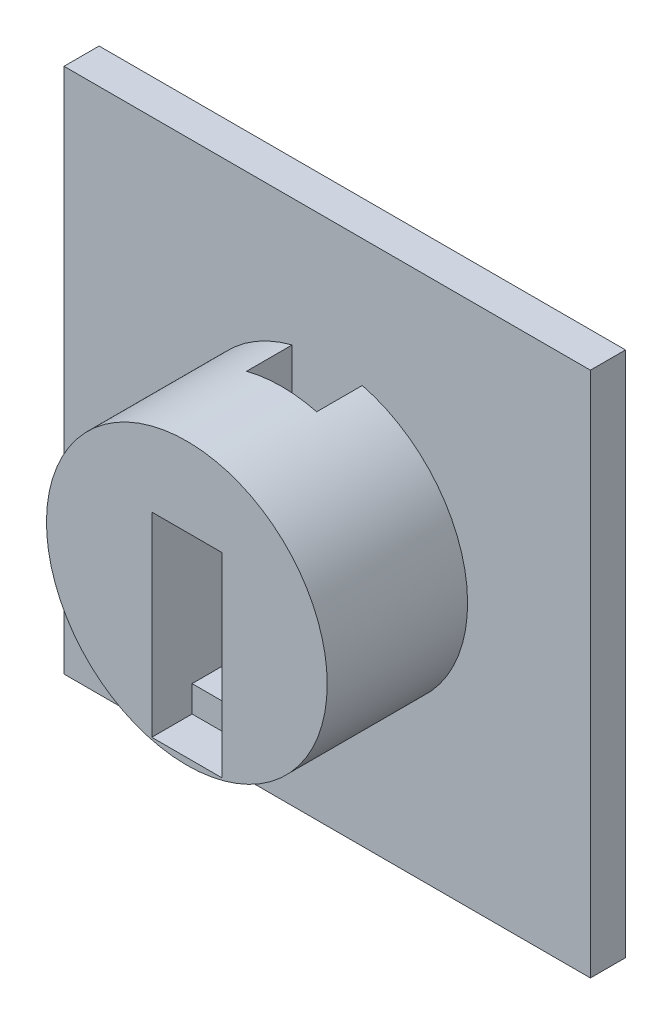
ISO-10303-21;
HEADER;
FILE_DESCRIPTION(('STEP AP214'),'2;1');
FILE_NAME('part.step','',(''),(''),'','','');
FILE_SCHEMA(('AUTOMOTIVE_DESIGN { 1 0 10303 214 1 1 1 1 }'));
ENDSEC;
DATA;
#1=APPLICATION_CONTEXT('core data for automotive mechanical design processes');
#2=APPLICATION_PROTOCOL_DEFINITION('international standard','automotive_design',2000,#1);
#3=PRODUCT_CONTEXT('',#1,'mechanical');
#4=PRODUCT('Part','Part','',(#3));
#5=PRODUCT_RELATED_PRODUCT_CATEGORY('part','',(#4));
#6=PRODUCT_DEFINITION_FORMATION('','',#4);
#7=PRODUCT_DEFINITION_CONTEXT('part definition',#1,'design');
#8=PRODUCT_DEFINITION('design','',#6,#7);
#9=PRODUCT_DEFINITION_SHAPE('','',#8);
#10=(LENGTH_UNIT() NAMED_UNIT(*) SI_UNIT(.MILLI.,.METRE.));
#11=(NAMED_UNIT(*) PLANE_ANGLE_UNIT() SI_UNIT($,.RADIAN.));
#12=(NAMED_UNIT(*) SI_UNIT($,.STERADIAN.) SOLID_ANGLE_UNIT());
#13=UNCERTAINTY_MEASURE_WITH_UNIT(LENGTH_MEASURE(1.E-05),#10,'distance_accuracy_value','');
#14=(GEOMETRIC_REPRESENTATION_CONTEXT(3) GLOBAL_UNCERTAINTY_ASSIGNED_CONTEXT((#13)) GLOBAL_UNIT_ASSIGNED_CONTEXT((#10,
#11,#12)) REPRESENTATION_CONTEXT('',''));
#15=CARTESIAN_POINT('',(0.,0.,0.));
#16=DIRECTION('',(0.,0.,1.));
#17=DIRECTION('',(1.,0.,0.));
#18=AXIS2_PLACEMENT_3D('',#15,#16,#17);
#19=CARTESIAN_POINT('',(0.,10.,9.00000000000001));
#20=DIRECTION('',(0.,1.,0.));
#21=DIRECTION('',(0.,0.,1.));
#22=AXIS2_PLACEMENT_3D('',#19,#20,#21);
#23=PLANE('',#22);
#24=DIRECTION('',(1.,0.,0.));
#25=VECTOR('',#24,1.);
#26=CARTESIAN_POINT('',(-9.99999999999999,10.,23.));
#27=LINE('',#26,#25);
#28=CARTESIAN_POINT('',(-9.99999999999999,10.,23.));
#29=VERTEX_POINT('',#28);
#30=CARTESIAN_POINT('',(10.,10.,23.));
#31=VERTEX_POINT('',#30);
#32=EDGE_CURVE('E332',#29,#31,#27,.T.);
#33=ORIENTED_EDGE('',*,*,#32,.T.);
#34=DIRECTION('',(0.,0.,1.));
#35=VECTOR('',#34,1.);
#36=CARTESIAN_POINT('',(10.,10.,9.00000000000001));
#37=LINE('',#36,#35);
#38=CARTESIAN_POINT('',(10.,10.,38.5));
#39=VERTEX_POINT('',#38);
#40=EDGE_CURVE('E195',#31,#39,#37,.T.);
#41=ORIENTED_EDGE('',*,*,#40,.T.);
#42=DIRECTION('',(1.,0.,0.));
#43=VECTOR('',#42,1.);
#44=CARTESIAN_POINT('',(10.,10.,38.5));
#45=LINE('',#44,#43);
#46=CARTESIAN_POINT('',(-9.99999999999999,10.,38.5));
#47=VERTEX_POINT('',#46);
#48=EDGE_CURVE('E381',#47,#39,#45,.T.);
#49=ORIENTED_EDGE('',*,*,#48,.F.);
#50=DIRECTION('',(0.,0.,1.));
#51=VECTOR('',#50,1.);
#52=CARTESIAN_POINT('',(-10.,10.,9.00000000000001));
#53=LINE('',#52,#51);
#54=EDGE_CURVE('E184',#29,#47,#53,.T.);
#55=ORIENTED_EDGE('',*,*,#54,.F.);
#56=EDGE_LOOP('',(#33,#41,#49,#55));
#57=FACE_BOUND('',#56,.T.);
#58=ADVANCED_FACE('F45',(#57),#23,.F.);
#59=CARTESIAN_POINT('',(-9.99999999999999,-30.6,9.00000000000001));
#60=DIRECTION('',(0.,-1.,0.));
#61=DIRECTION('',(0.,0.,-1.));
#62=AXIS2_PLACEMENT_3D('',#59,#60,#61);
#63=PLANE('',#62);
#64=DIRECTION('',(-1.,0.,0.));
#65=VECTOR('',#64,1.);
#66=CARTESIAN_POINT('',(-9.99999999999999,-30.6,38.5));
#67=LINE('',#66,#65);
#68=CARTESIAN_POINT('',(10.,-30.6,38.5));
#69=VERTEX_POINT('',#68);
#70=CARTESIAN_POINT('',(-9.99999999999999,-30.6,38.5));
#71=VERTEX_POINT('',#70);
#72=EDGE_CURVE('E341',#69,#71,#67,.T.);
#73=ORIENTED_EDGE('',*,*,#72,.F.);
#74=DIRECTION('',(0.,0.,1.));
#75=VECTOR('',#74,1.);
#76=CARTESIAN_POINT('',(10.,-30.6,9.00000000000001));
#77=LINE('',#76,#75);
#78=CARTESIAN_POINT('',(10.,-30.6,9.00000000000001));
#79=VERTEX_POINT('',#78);
#80=EDGE_CURVE('E196',#79,#69,#77,.T.);
#81=ORIENTED_EDGE('',*,*,#80,.F.);
#82=DIRECTION('',(1.,0.,0.));
#83=VECTOR('',#82,1.);
#84=CARTESIAN_POINT('',(-9.99999999999999,-30.6,9.00000000000001));
#85=LINE('',#84,#83);
#86=CARTESIAN_POINT('',(-9.99999999999999,-30.6,9.00000000000001));
#87=VERTEX_POINT('',#86);
#88=EDGE_CURVE('E396',#87,#79,#85,.T.);
#89=ORIENTED_EDGE('',*,*,#88,.F.);
#90=DIRECTION('',(0.,0.,1.));
#91=VECTOR('',#90,1.);
#92=CARTESIAN_POINT('',(-9.99999999999999,-30.6,9.00000000000001));
#93=LINE('',#92,#91);
#94=EDGE_CURVE('E183',#87,#71,#93,.T.);
#95=ORIENTED_EDGE('',*,*,#94,.T.);
#96=EDGE_LOOP('',(#73,#81,#89,#95));
#97=FACE_BOUND('',#96,.T.);
#98=ADVANCED_FACE('F272',(#97),#63,.F.);
#99=CARTESIAN_POINT('',(-75.,-75.,10.));
#100=DIRECTION('',(0.,1.,0.));
#101=DIRECTION('',(-1.,0.,0.));
#102=AXIS2_PLACEMENT_3D('',#99,#100,#101);
#103=PLANE('',#102);
#104=DIRECTION('',(1.,0.,0.));
#105=VECTOR('',#104,1.);
#106=CARTESIAN_POINT('',(-75.,-75.,0.));
#107=LINE('',#106,#105);
#108=CARTESIAN_POINT('',(-75.,-75.,0.));
#109=VERTEX_POINT('',#108);
#110=CARTESIAN_POINT('',(75.,-75.,0.));
#111=VERTEX_POINT('',#110);
#112=EDGE_CURVE('E202',#109,#111,#107,.T.);
#113=ORIENTED_EDGE('',*,*,#112,.T.);
#114=DIRECTION('',(0.,0.,-1.));
#115=VECTOR('',#114,1.);
#116=CARTESIAN_POINT('',(75.,-75.,10.));
#117=LINE('',#116,#115);
#118=CARTESIAN_POINT('',(75.,-75.,10.));
#119=VERTEX_POINT('',#118);
#120=EDGE_CURVE('E49',#119,#111,#117,.T.);
#121=ORIENTED_EDGE('',*,*,#120,.F.);
#122=DIRECTION('',(1.,0.,0.));
#123=VECTOR('',#122,1.);
#124=CARTESIAN_POINT('',(-75.,-75.,10.));
#125=LINE('',#124,#123);
#126=CARTESIAN_POINT('',(-75.,-75.,10.));
#127=VERTEX_POINT('',#126);
#128=EDGE_CURVE('E204',#127,#119,#125,.T.);
#129=ORIENTED_EDGE('',*,*,#128,.F.);
#130=DIRECTION('',(0.,0.,-1.));
#131=VECTOR('',#130,1.);
#132=CARTESIAN_POINT('',(-75.,-75.,10.));
#133=LINE('',#132,#131);
#134=EDGE_CURVE('E218',#127,#109,#133,.T.);
#135=ORIENTED_EDGE('',*,*,#134,.T.);
#136=EDGE_LOOP('',(#113,#121,#129,#135));
#137=FACE_BOUND('',#136,.T.);
#138=ADVANCED_FACE('F47',(#137),#103,.F.);
#139=CARTESIAN_POINT('',(75.,75.,10.));
#140=DIRECTION('',(-1.,0.,0.));
#141=DIRECTION('',(0.,-1.,0.));
#142=AXIS2_PLACEMENT_3D('',#139,#140,#141);
#143=PLANE('',#142);
#144=DIRECTION('',(0.,1.,0.));
#145=VECTOR('',#144,1.);
#146=CARTESIAN_POINT('',(75.,75.,0.));
#147=LINE('',#146,#145);
#148=CARTESIAN_POINT('',(75.,75.,0.));
#149=VERTEX_POINT('',#148);
#150=EDGE_CURVE('E222',#111,#149,#147,.T.);
#151=ORIENTED_EDGE('',*,*,#150,.T.);
#152=DIRECTION('',(0.,0.,-1.));
#153=VECTOR('',#152,1.);
#154=CARTESIAN_POINT('',(75.,75.,10.));
#155=LINE('',#154,#153);
#156=CARTESIAN_POINT('',(75.,75.,10.));
#157=VERTEX_POINT('',#156);
#158=EDGE_CURVE('E236',#157,#149,#155,.T.);
#159=ORIENTED_EDGE('',*,*,#158,.F.);
#160=DIRECTION('',(0.,1.,0.));
#161=VECTOR('',#160,1.);
#162=CARTESIAN_POINT('',(75.,75.,10.));
#163=LINE('',#162,#161);
#164=EDGE_CURVE('E208',#119,#157,#163,.T.);
#165=ORIENTED_EDGE('',*,*,#164,.F.);
#166=ORIENTED_EDGE('',*,*,#120,.T.);
#167=EDGE_LOOP('',(#151,#159,#165,#166));
#168=FACE_BOUND('',#167,.T.);
#169=ADVANCED_FACE('F247',(#168),#143,.F.);
#170=CARTESIAN_POINT('',(-75.,75.,10.));
#171=DIRECTION('',(0.,-1.,0.));
#172=DIRECTION('',(1.,0.,0.));
#173=AXIS2_PLACEMENT_3D('',#170,#171,#172);
#174=PLANE('',#173);
#175=DIRECTION('',(-1.,0.,0.));
#176=VECTOR('',#175,1.);
#177=CARTESIAN_POINT('',(-75.,75.,0.));
#178=LINE('',#177,#176);
#179=CARTESIAN_POINT('',(-75.,75.,0.));
#180=VERTEX_POINT('',#179);
#181=EDGE_CURVE('E225',#149,#180,#178,.T.);
#182=ORIENTED_EDGE('',*,*,#181,.T.);
#183=DIRECTION('',(0.,0.,-1.));
#184=VECTOR('',#183,1.);
#185=CARTESIAN_POINT('',(-75.,75.,10.));
#186=LINE('',#185,#184);
#187=CARTESIAN_POINT('',(-75.,75.,10.));
#188=VERTEX_POINT('',#187);
#189=EDGE_CURVE('E233',#188,#180,#186,.T.);
#190=ORIENTED_EDGE('',*,*,#189,.F.);
#191=DIRECTION('',(-1.,0.,0.));
#192=VECTOR('',#191,1.);
#193=CARTESIAN_POINT('',(-75.,75.,10.));
#194=LINE('',#193,#192);
#195=EDGE_CURVE('E212',#157,#188,#194,.T.);
#196=ORIENTED_EDGE('',*,*,#195,.F.);
#197=ORIENTED_EDGE('',*,*,#158,.T.);
#198=EDGE_LOOP('',(#182,#190,#196,#197));
#199=FACE_BOUND('',#198,.T.);
#200=ADVANCED_FACE('F256',(#199),#174,.F.);
#201=CARTESIAN_POINT('',(-75.,75.,10.));
#202=DIRECTION('',(1.,0.,0.));
#203=DIRECTION('',(0.,1.,0.));
#204=AXIS2_PLACEMENT_3D('',#201,#202,#203);
#205=PLANE('',#204);
#206=DIRECTION('',(0.,-1.,0.));
#207=VECTOR('',#206,1.);
#208=CARTESIAN_POINT('',(-75.,75.,0.));
#209=LINE('',#208,#207);
#210=EDGE_CURVE('E209',#180,#109,#209,.T.);
#211=ORIENTED_EDGE('',*,*,#210,.T.);
#212=ORIENTED_EDGE('',*,*,#134,.F.);
#213=DIRECTION('',(0.,-1.,0.));
#214=VECTOR('',#213,1.);
#215=CARTESIAN_POINT('',(-75.,75.,10.));
#216=LINE('',#215,#214);
#217=EDGE_CURVE('E215',#188,#127,#216,.T.);
#218=ORIENTED_EDGE('',*,*,#217,.F.);
#219=ORIENTED_EDGE('',*,*,#189,.T.);
#220=EDGE_LOOP('',(#211,#212,#218,#219));
#221=FACE_BOUND('',#220,.T.);
#222=ADVANCED_FACE('F259',(#221),#205,.F.);
#223=CARTESIAN_POINT('',(0.,0.,10.));
#224=DIRECTION('',(0.,0.,-1.));
#225=DIRECTION('',(-1.,0.,0.));
#226=AXIS2_PLACEMENT_3D('',#223,#224,#225);
#227=PLANE('',#226);
#228=CARTESIAN_POINT('',(0.,0.,10.));
#229=DIRECTION('',(0.,0.,1.));
#230=DIRECTION('',(1.,0.,0.));
#231=AXIS2_PLACEMENT_3D('',#228,#229,#230);
#232=CIRCLE('',#231,40.);
#233=CARTESIAN_POINT('',(-9.99999999999999,38.7298334620742,9.99999999999999));
#234=VERTEX_POINT('',#233);
#235=CARTESIAN_POINT('',(10.,38.7298334620742,9.99999999999999));
#236=VERTEX_POINT('',#235);
#237=EDGE_CURVE('E11',#234,#236,#232,.T.);
#238=ORIENTED_EDGE('',*,*,#237,.F.);
#239=DIRECTION('',(0.,-1.,0.));
#240=VECTOR('',#239,1.);
#241=CARTESIAN_POINT('',(-9.99999999999999,10.,10.));
#242=LINE('',#241,#240);
#243=CARTESIAN_POINT('',(-9.99999999999999,10.,10.));
#244=VERTEX_POINT('',#243);
#245=EDGE_CURVE('E159',#234,#244,#242,.T.);
#246=ORIENTED_EDGE('',*,*,#245,.T.);
#247=DIRECTION('',(1.,0.,0.));
#248=VECTOR('',#247,1.);
#249=CARTESIAN_POINT('',(-9.99999999999999,10.,10.));
#250=LINE('',#249,#248);
#251=CARTESIAN_POINT('',(10.,10.,10.));
#252=VERTEX_POINT('',#251);
#253=EDGE_CURVE('E70',#244,#252,#250,.T.);
#254=ORIENTED_EDGE('',*,*,#253,.T.);
#255=DIRECTION('',(0.,1.,0.));
#256=VECTOR('',#255,1.);
#257=CARTESIAN_POINT('',(10.,10.,10.));
#258=LINE('',#257,#256);
#259=EDGE_CURVE('E177',#252,#236,#258,.T.);
#260=ORIENTED_EDGE('',*,*,#259,.T.);
#261=EDGE_LOOP('',(#238,#246,#254,#260));
#262=FACE_BOUND('',#261,.T.);
#263=ORIENTED_EDGE('',*,*,#128,.T.);
#264=ORIENTED_EDGE('',*,*,#164,.T.);
#265=ORIENTED_EDGE('',*,*,#195,.T.);
#266=ORIENTED_EDGE('',*,*,#217,.T.);
#267=EDGE_LOOP('',(#263,#264,#265,#266));
#268=FACE_BOUND('',#267,.T.);
#269=ADVANCED_FACE('F160',(#262,#268),#227,.F.);
#270=CARTESIAN_POINT('',(0.,0.,0.));
#271=DIRECTION('',(0.,0.,-1.));
#272=DIRECTION('',(-1.,0.,0.));
#273=AXIS2_PLACEMENT_3D('',#270,#271,#272);
#274=PLANE('',#273);
#275=ORIENTED_EDGE('',*,*,#112,.F.);
#276=ORIENTED_EDGE('',*,*,#210,.F.);
#277=ORIENTED_EDGE('',*,*,#181,.F.);
#278=ORIENTED_EDGE('',*,*,#150,.F.);
#279=EDGE_LOOP('',(#275,#276,#277,#278));
#280=FACE_BOUND('',#279,.T.);
#281=ADVANCED_FACE('F254',(#280),#274,.T.);
#282=CARTESIAN_POINT('',(0.,0.,50.));
#283=DIRECTION('',(0.,0.,-1.));
#284=DIRECTION('',(-1.,0.,0.));
#285=AXIS2_PLACEMENT_3D('',#282,#283,#284);
#286=CYLINDRICAL_SURFACE('',#285,40.);
#287=CARTESIAN_POINT('',(0.,0.,50.));
#288=DIRECTION('',(0.,0.,1.));
#289=DIRECTION('',(1.,0.,0.));
#290=AXIS2_PLACEMENT_3D('',#287,#288,#289);
#291=CIRCLE('',#290,40.);
#292=CARTESIAN_POINT('',(40.,0.,50.));
#293=VERTEX_POINT('',#292);
#294=EDGE_CURVE('E189',#293,#293,#291,.T.);
#295=ORIENTED_EDGE('',*,*,#294,.F.);
#296=EDGE_LOOP('',(#295));
#297=FACE_BOUND('',#296,.T.);
#298=CARTESIAN_POINT('',(0.,0.,23.));
#299=DIRECTION('',(0.,0.,-1.));
#300=DIRECTION('',(-1.,0.,0.));
#301=AXIS2_PLACEMENT_3D('',#298,#299,#300);
#302=CIRCLE('',#301,40.);
#303=CARTESIAN_POINT('',(-9.99999999999999,38.7298334620742,23.));
#304=VERTEX_POINT('',#303);
#305=CARTESIAN_POINT('',(10.,38.7298334620742,23.));
#306=VERTEX_POINT('',#305);
#307=EDGE_CURVE('E322',#304,#306,#302,.T.);
#308=ORIENTED_EDGE('',*,*,#307,.F.);
#309=DIRECTION('',(0.,0.,-1.));
#310=VECTOR('',#309,1.);
#311=CARTESIAN_POINT('',(-9.99999999999999,38.7298334620742,50.));
#312=LINE('',#311,#310);
#313=EDGE_CURVE('E335',#304,#234,#312,.T.);
#314=ORIENTED_EDGE('',*,*,#313,.T.);
#315=ORIENTED_EDGE('',*,*,#237,.T.);
#316=DIRECTION('',(0.,0.,-1.));
#317=VECTOR('',#316,1.);
#318=CARTESIAN_POINT('',(10.,38.7298334620742,50.));
#319=LINE('',#318,#317);
#320=EDGE_CURVE('E327',#236,#306,#319,.F.);
#321=ORIENTED_EDGE('',*,*,#320,.T.);
#322=EDGE_LOOP('',(#308,#314,#315,#321));
#323=FACE_BOUND('',#322,.T.);
#324=ADVANCED_FACE('F267',(#297,#323),#286,.T.);
#325=CARTESIAN_POINT('',(0.,0.,50.));
#326=DIRECTION('',(0.,0.,1.));
#327=DIRECTION('',(1.,0.,0.));
#328=AXIS2_PLACEMENT_3D('',#325,#326,#327);
#329=PLANE('',#328);
#330=DIRECTION('',(0.,1.,0.));
#331=VECTOR('',#330,1.);
#332=CARTESIAN_POINT('',(10.,-30.6,50.));
#333=LINE('',#332,#331);
#334=CARTESIAN_POINT('',(10.,-38.1,50.));
#335=VERTEX_POINT('',#334);
#336=CARTESIAN_POINT('',(10.,17.5,50.));
#337=VERTEX_POINT('',#336);
#338=EDGE_CURVE('E366',#335,#337,#333,.T.);
#339=ORIENTED_EDGE('',*,*,#338,.F.);
#340=DIRECTION('',(1.,0.,0.));
#341=VECTOR('',#340,1.);
#342=CARTESIAN_POINT('',(-9.99999999999999,-38.1,50.));
#343=LINE('',#342,#341);
#344=CARTESIAN_POINT('',(-9.99999999999999,-38.1,50.));
#345=VERTEX_POINT('',#344);
#346=EDGE_CURVE('E346',#345,#335,#343,.T.);
#347=ORIENTED_EDGE('',*,*,#346,.F.);
#348=DIRECTION('',(0.,-1.,0.));
#349=VECTOR('',#348,1.);
#350=CARTESIAN_POINT('',(-10.,10.,50.));
#351=LINE('',#350,#349);
#352=CARTESIAN_POINT('',(-10.,17.5,50.));
#353=VERTEX_POINT('',#352);
#354=EDGE_CURVE('E401',#353,#345,#351,.T.);
#355=ORIENTED_EDGE('',*,*,#354,.F.);
#356=DIRECTION('',(-1.,0.,0.));
#357=VECTOR('',#356,1.);
#358=CARTESIAN_POINT('',(-10.,17.5,50.));
#359=LINE('',#358,#357);
#360=EDGE_CURVE('E361',#337,#353,#359,.T.);
#361=ORIENTED_EDGE('',*,*,#360,.F.);
#362=EDGE_LOOP('',(#339,#347,#355,#361));
#363=FACE_BOUND('',#362,.T.);
#364=ORIENTED_EDGE('',*,*,#294,.T.);
#365=EDGE_LOOP('',(#364));
#366=FACE_BOUND('',#365,.T.);
#367=ADVANCED_FACE('F292',(#363,#366),#329,.T.);
#368=CARTESIAN_POINT('',(-10.,10.,9.00000000000001));
#369=DIRECTION('',(-1.,0.,0.));
#370=DIRECTION('',(0.,-1.,0.));
#371=AXIS2_PLACEMENT_3D('',#368,#369,#370);
#372=PLANE('',#371);
#373=ORIENTED_EDGE('',*,*,#354,.T.);
#374=DIRECTION('',(0.,0.,1.));
#375=VECTOR('',#374,1.);
#376=CARTESIAN_POINT('',(-9.99999999999999,-38.1,38.5));
#377=LINE('',#376,#375);
#378=CARTESIAN_POINT('',(-9.99999999999999,-38.1,38.5));
#379=VERTEX_POINT('',#378);
#380=EDGE_CURVE('E357',#379,#345,#377,.T.);
#381=ORIENTED_EDGE('',*,*,#380,.F.);
#382=DIRECTION('',(0.,-1.,0.));
#383=VECTOR('',#382,1.);
#384=CARTESIAN_POINT('',(-9.99999999999999,-30.6,38.5));
#385=LINE('',#384,#383);
#386=EDGE_CURVE('E345',#71,#379,#385,.T.);
#387=ORIENTED_EDGE('',*,*,#386,.F.);
#388=ORIENTED_EDGE('',*,*,#94,.F.);
#389=DIRECTION('',(0.,-1.,0.));
#390=VECTOR('',#389,1.);
#391=CARTESIAN_POINT('',(-10.,10.,9.00000000000001));
#392=LINE('',#391,#390);
#393=CARTESIAN_POINT('',(-10.,10.,9.00000000000001));
#394=VERTEX_POINT('',#393);
#395=EDGE_CURVE('E181',#394,#87,#392,.T.);
#396=ORIENTED_EDGE('',*,*,#395,.F.);
#397=EDGE_CURVE('E173',#394,#244,#53,.T.);
#398=ORIENTED_EDGE('',*,*,#397,.T.);
#399=ORIENTED_EDGE('',*,*,#245,.F.);
#400=ORIENTED_EDGE('',*,*,#313,.F.);
#401=DIRECTION('',(0.,-1.,0.));
#402=VECTOR('',#401,1.);
#403=CARTESIAN_POINT('',(-9.99999999999999,10.,23.));
#404=LINE('',#403,#402);
#405=EDGE_CURVE('E62',#304,#29,#404,.T.);
#406=ORIENTED_EDGE('',*,*,#405,.T.);
#407=ORIENTED_EDGE('',*,*,#54,.T.);
#408=DIRECTION('',(0.,-1.,0.));
#409=VECTOR('',#408,1.);
#410=CARTESIAN_POINT('',(-9.99999999999999,10.,38.5));
#411=LINE('',#410,#409);
#412=CARTESIAN_POINT('',(-10.,17.5,38.5));
#413=VERTEX_POINT('',#412);
#414=EDGE_CURVE('E374',#413,#47,#411,.T.);
#415=ORIENTED_EDGE('',*,*,#414,.F.);
#416=DIRECTION('',(0.,0.,1.));
#417=VECTOR('',#416,1.);
#418=CARTESIAN_POINT('',(-10.,17.5,38.5));
#419=LINE('',#418,#417);
#420=EDGE_CURVE('E338',#413,#353,#419,.T.);
#421=ORIENTED_EDGE('',*,*,#420,.T.);
#422=EDGE_LOOP('',(#373,#381,#387,#388,#396,#398,#399,#400,#406,#407,#415,#421));
#423=FACE_BOUND('',#422,.T.);
#424=ADVANCED_FACE('F179',(#423),#372,.F.);
#425=CARTESIAN_POINT('',(10.,10.,9.00000000000001));
#426=VERTEX_POINT('',#425);
#427=EDGE_CURVE('E175',#426,#252,#37,.T.);
#428=ORIENTED_EDGE('',*,*,#427,.T.);
#429=ORIENTED_EDGE('',*,*,#253,.F.);
#430=ORIENTED_EDGE('',*,*,#397,.F.);
#431=DIRECTION('',(-1.,0.,0.));
#432=VECTOR('',#431,1.);
#433=CARTESIAN_POINT('',(10.,10.,9.00000000000001));
#434=LINE('',#433,#432);
#435=EDGE_CURVE('E405',#426,#394,#434,.T.);
#436=ORIENTED_EDGE('',*,*,#435,.F.);
#437=EDGE_LOOP('',(#428,#429,#430,#436));
#438=FACE_BOUND('',#437,.T.);
#439=ADVANCED_FACE('F171',(#438),#23,.F.);
#440=CARTESIAN_POINT('',(10.,-30.6,9.00000000000001));
#441=DIRECTION('',(1.,0.,0.));
#442=DIRECTION('',(0.,0.,-1.));
#443=AXIS2_PLACEMENT_3D('',#440,#441,#442);
#444=PLANE('',#443);
#445=ORIENTED_EDGE('',*,*,#338,.T.);
#446=DIRECTION('',(0.,0.,1.));
#447=VECTOR('',#446,1.);
#448=CARTESIAN_POINT('',(10.,17.5,38.5));
#449=LINE('',#448,#447);
#450=CARTESIAN_POINT('',(10.,17.5,38.5));
#451=VERTEX_POINT('',#450);
#452=EDGE_CURVE('E370',#451,#337,#449,.T.);
#453=ORIENTED_EDGE('',*,*,#452,.F.);
#454=DIRECTION('',(0.,1.,0.));
#455=VECTOR('',#454,1.);
#456=CARTESIAN_POINT('',(10.,17.5,38.5));
#457=LINE('',#456,#455);
#458=EDGE_CURVE('E389',#39,#451,#457,.T.);
#459=ORIENTED_EDGE('',*,*,#458,.F.);
#460=ORIENTED_EDGE('',*,*,#40,.F.);
#461=DIRECTION('',(0.,1.,0.));
#462=VECTOR('',#461,1.);
#463=CARTESIAN_POINT('',(10.,10.,23.));
#464=LINE('',#463,#462);
#465=EDGE_CURVE('E166',#31,#306,#464,.T.);
#466=ORIENTED_EDGE('',*,*,#465,.T.);
#467=ORIENTED_EDGE('',*,*,#320,.F.);
#468=ORIENTED_EDGE('',*,*,#259,.F.);
#469=ORIENTED_EDGE('',*,*,#427,.F.);
#470=DIRECTION('',(0.,1.,0.));
#471=VECTOR('',#470,1.);
#472=CARTESIAN_POINT('',(10.,-30.6,9.00000000000001));
#473=LINE('',#472,#471);
#474=EDGE_CURVE('E400',#79,#426,#473,.T.);
#475=ORIENTED_EDGE('',*,*,#474,.F.);
#476=ORIENTED_EDGE('',*,*,#80,.T.);
#477=DIRECTION('',(0.,1.,0.));
#478=VECTOR('',#477,1.);
#479=CARTESIAN_POINT('',(10.,-38.1,38.5));
#480=LINE('',#479,#478);
#481=CARTESIAN_POINT('',(10.,-38.1,38.5));
#482=VERTEX_POINT('',#481);
#483=EDGE_CURVE('E354',#482,#69,#480,.T.);
#484=ORIENTED_EDGE('',*,*,#483,.F.);
#485=DIRECTION('',(0.,0.,1.));
#486=VECTOR('',#485,1.);
#487=CARTESIAN_POINT('',(10.,-38.1,38.5));
#488=LINE('',#487,#486);
#489=EDGE_CURVE('E362',#482,#335,#488,.T.);
#490=ORIENTED_EDGE('',*,*,#489,.T.);
#491=EDGE_LOOP('',(#445,#453,#459,#460,#466,#467,#468,#469,#475,#476,#484,#490));
#492=FACE_BOUND('',#491,.T.);
#493=ADVANCED_FACE('F285',(#492),#444,.F.);
#494=CARTESIAN_POINT('',(0.,0.,9.00000000000001));
#495=DIRECTION('',(0.,0.,1.));
#496=DIRECTION('',(1.,0.,0.));
#497=AXIS2_PLACEMENT_3D('',#494,#495,#496);
#498=PLANE('',#497);
#499=ORIENTED_EDGE('',*,*,#88,.T.);
#500=ORIENTED_EDGE('',*,*,#474,.T.);
#501=ORIENTED_EDGE('',*,*,#435,.T.);
#502=ORIENTED_EDGE('',*,*,#395,.T.);
#503=EDGE_LOOP('',(#499,#500,#501,#502));
#504=FACE_BOUND('',#503,.T.);
#505=ADVANCED_FACE('F290',(#504),#498,.T.);
#506=CARTESIAN_POINT('',(-10.,17.5,38.5));
#507=DIRECTION('',(0.,1.,0.));
#508=DIRECTION('',(0.,0.,1.));
#509=AXIS2_PLACEMENT_3D('',#506,#507,#508);
#510=PLANE('',#509);
#511=ORIENTED_EDGE('',*,*,#360,.T.);
#512=ORIENTED_EDGE('',*,*,#420,.F.);
#513=DIRECTION('',(-1.,0.,0.));
#514=VECTOR('',#513,1.);
#515=CARTESIAN_POINT('',(-10.,17.5,38.5));
#516=LINE('',#515,#514);
#517=EDGE_CURVE('E385',#451,#413,#516,.T.);
#518=ORIENTED_EDGE('',*,*,#517,.F.);
#519=ORIENTED_EDGE('',*,*,#452,.T.);
#520=EDGE_LOOP('',(#511,#512,#518,#519));
#521=FACE_BOUND('',#520,.T.);
#522=ADVANCED_FACE('F301',(#521),#510,.F.);
#523=CARTESIAN_POINT('',(0.,0.,38.5));
#524=DIRECTION('',(0.,0.,-1.));
#525=DIRECTION('',(-1.,0.,0.));
#526=AXIS2_PLACEMENT_3D('',#523,#524,#525);
#527=PLANE('',#526);
#528=ORIENTED_EDGE('',*,*,#48,.T.);
#529=ORIENTED_EDGE('',*,*,#458,.T.);
#530=ORIENTED_EDGE('',*,*,#517,.T.);
#531=ORIENTED_EDGE('',*,*,#414,.T.);
#532=EDGE_LOOP('',(#528,#529,#530,#531));
#533=FACE_BOUND('',#532,.T.);
#534=ADVANCED_FACE('F303',(#533),#527,.F.);
#535=CARTESIAN_POINT('',(-9.99999999999999,-38.1,38.5));
#536=DIRECTION('',(0.,-1.,0.));
#537=DIRECTION('',(0.,0.,-1.));
#538=AXIS2_PLACEMENT_3D('',#535,#536,#537);
#539=PLANE('',#538);
#540=ORIENTED_EDGE('',*,*,#346,.T.);
#541=ORIENTED_EDGE('',*,*,#489,.F.);
#542=DIRECTION('',(1.,0.,0.));
#543=VECTOR('',#542,1.);
#544=CARTESIAN_POINT('',(-9.99999999999999,-38.1,38.5));
#545=LINE('',#544,#543);
#546=EDGE_CURVE('E350',#379,#482,#545,.T.);
#547=ORIENTED_EDGE('',*,*,#546,.F.);
#548=ORIENTED_EDGE('',*,*,#380,.T.);
#549=EDGE_LOOP('',(#540,#541,#547,#548));
#550=FACE_BOUND('',#549,.T.);
#551=ADVANCED_FACE('F306',(#550),#539,.F.);
#552=CARTESIAN_POINT('',(0.,0.,38.5));
#553=DIRECTION('',(0.,0.,1.));
#554=DIRECTION('',(1.,0.,0.));
#555=AXIS2_PLACEMENT_3D('',#552,#553,#554);
#556=PLANE('',#555);
#557=ORIENTED_EDGE('',*,*,#72,.T.);
#558=ORIENTED_EDGE('',*,*,#386,.T.);
#559=ORIENTED_EDGE('',*,*,#546,.T.);
#560=ORIENTED_EDGE('',*,*,#483,.T.);
#561=EDGE_LOOP('',(#557,#558,#559,#560));
#562=FACE_BOUND('',#561,.T.);
#563=ADVANCED_FACE('F313',(#562),#556,.T.);
#564=CARTESIAN_POINT('',(0.,0.,23.));
#565=DIRECTION('',(0.,0.,-1.));
#566=DIRECTION('',(-1.,0.,0.));
#567=AXIS2_PLACEMENT_3D('',#564,#565,#566);
#568=PLANE('',#567);
#569=ORIENTED_EDGE('',*,*,#307,.T.);
#570=ORIENTED_EDGE('',*,*,#465,.F.);
#571=ORIENTED_EDGE('',*,*,#32,.F.);
#572=ORIENTED_EDGE('',*,*,#405,.F.);
#573=EDGE_LOOP('',(#569,#570,#571,#572));
#574=FACE_BOUND('',#573,.T.);
#575=ADVANCED_FACE('F316',(#574),#568,.T.);
#576=CLOSED_SHELL('',(#58,#98,#138,#169,#200,#222,#269,#281,#324,#367,#424,#439,#493,#505,#522,
#534,#551,#563,#575));
#577=MANIFOLD_SOLID_BREP('B2',#576);
#578=ADVANCED_BREP_SHAPE_REPRESENTATION('',(#18,#577),#14);
#579=SHAPE_DEFINITION_REPRESENTATION(#9,#578);
ENDSEC;
END-ISO-10303-21;
